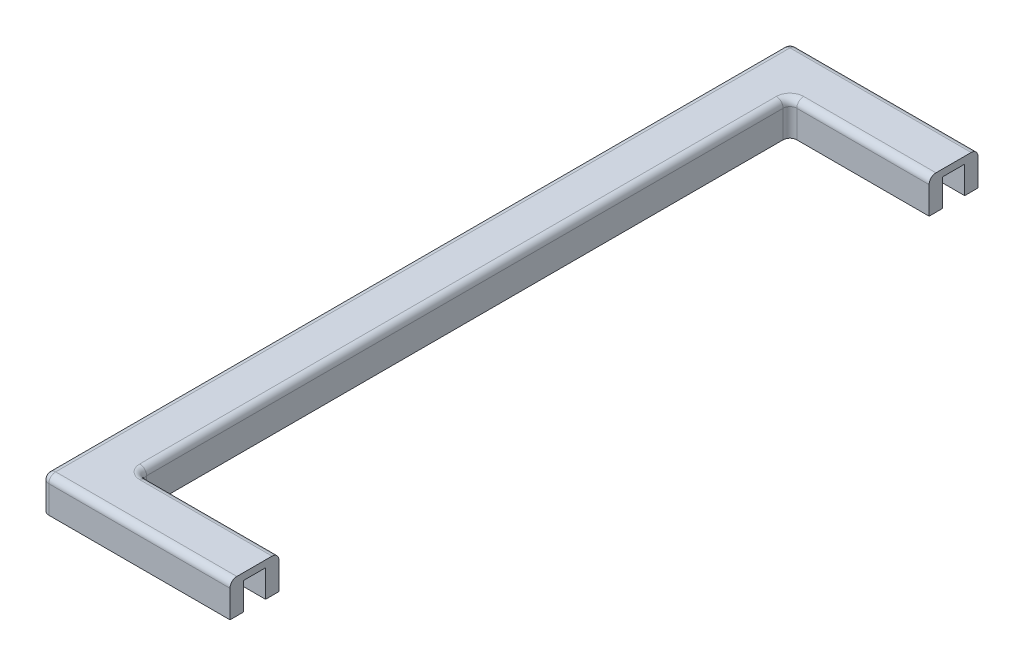
ISO-10303-21;
HEADER;
FILE_DESCRIPTION(('STEP AP214'),'2;1');
FILE_NAME('part.step','',(''),(''),'','','');
FILE_SCHEMA(('AUTOMOTIVE_DESIGN { 1 0 10303 214 1 1 1 1 }'));
ENDSEC;
DATA;
#1=APPLICATION_CONTEXT('core data for automotive mechanical design processes');
#2=APPLICATION_PROTOCOL_DEFINITION('international standard','automotive_design',2000,#1);
#3=PRODUCT_CONTEXT('',#1,'mechanical');
#4=PRODUCT('Part','Part','',(#3));
#5=PRODUCT_RELATED_PRODUCT_CATEGORY('part','',(#4));
#6=PRODUCT_DEFINITION_FORMATION('','',#4);
#7=PRODUCT_DEFINITION_CONTEXT('part definition',#1,'design');
#8=PRODUCT_DEFINITION('design','',#6,#7);
#9=PRODUCT_DEFINITION_SHAPE('','',#8);
#10=(LENGTH_UNIT() NAMED_UNIT(*) SI_UNIT(.MILLI.,.METRE.));
#11=(NAMED_UNIT(*) PLANE_ANGLE_UNIT() SI_UNIT($,.RADIAN.));
#12=(NAMED_UNIT(*) SI_UNIT($,.STERADIAN.) SOLID_ANGLE_UNIT());
#13=UNCERTAINTY_MEASURE_WITH_UNIT(LENGTH_MEASURE(1.E-05),#10,'distance_accuracy_value','');
#14=(GEOMETRIC_REPRESENTATION_CONTEXT(3) GLOBAL_UNCERTAINTY_ASSIGNED_CONTEXT((#13)) GLOBAL_UNIT_ASSIGNED_CONTEXT((#10,
#11,#12)) REPRESENTATION_CONTEXT('',''));
#15=CARTESIAN_POINT('',(0.,0.,0.));
#16=DIRECTION('',(0.,0.,1.));
#17=DIRECTION('',(1.,0.,0.));
#18=AXIS2_PLACEMENT_3D('',#15,#16,#17);
#19=CARTESIAN_POINT('',(0.,8.,0.));
#20=DIRECTION('',(0.,-1.,0.));
#21=DIRECTION('',(0.,0.,-1.));
#22=AXIS2_PLACEMENT_3D('',#19,#20,#21);
#23=PLANE('',#22);
#24=DIRECTION('',(0.,0.,-1.));
#25=VECTOR('',#24,1.);
#26=CARTESIAN_POINT('',(-79.075,8.,0.));
#27=LINE('',#26,#25);
#28=CARTESIAN_POINT('',(-79.075,8.,105.5));
#29=VERTEX_POINT('',#28);
#30=CARTESIAN_POINT('',(-79.075,8.,99.));
#31=VERTEX_POINT('',#30);
#32=EDGE_CURVE('E369',#29,#31,#27,.T.);
#33=ORIENTED_EDGE('',*,*,#32,.F.);
#34=DIRECTION('',(1.,0.,0.));
#35=VECTOR('',#34,1.);
#36=CARTESIAN_POINT('',(0.,8.,105.5));
#37=LINE('',#36,#35);
#38=CARTESIAN_POINT('',(-130.175,8.,105.5));
#39=VERTEX_POINT('',#38);
#40=EDGE_CURVE('E407',#39,#29,#37,.T.);
#41=ORIENTED_EDGE('',*,*,#40,.F.);
#42=DIRECTION('',(0.,0.,-1.));
#43=VECTOR('',#42,1.);
#44=CARTESIAN_POINT('',(-130.175,8.,0.));
#45=LINE('',#44,#43);
#46=CARTESIAN_POINT('',(-130.175,8.,-105.5));
#47=VERTEX_POINT('',#46);
#48=EDGE_CURVE('E410',#39,#47,#45,.T.);
#49=ORIENTED_EDGE('',*,*,#48,.T.);
#50=DIRECTION('',(1.,0.,0.));
#51=VECTOR('',#50,1.);
#52=CARTESIAN_POINT('',(0.,8.,-105.5));
#53=LINE('',#52,#51);
#54=CARTESIAN_POINT('',(-79.075,8.,-105.5));
#55=VERTEX_POINT('',#54);
#56=EDGE_CURVE('E414',#47,#55,#53,.T.);
#57=ORIENTED_EDGE('',*,*,#56,.T.);
#58=CARTESIAN_POINT('',(-79.075,8.,-99.));
#59=VERTEX_POINT('',#58);
#60=EDGE_CURVE('E366',#59,#55,#27,.T.);
#61=ORIENTED_EDGE('',*,*,#60,.F.);
#62=DIRECTION('',(1.,0.,0.));
#63=VECTOR('',#62,1.);
#64=CARTESIAN_POINT('',(0.,8.,-99.));
#65=LINE('',#64,#63);
#66=CARTESIAN_POINT('',(-123.675,8.,-99.));
#67=VERTEX_POINT('',#66);
#68=EDGE_CURVE('E379',#67,#59,#65,.T.);
#69=ORIENTED_EDGE('',*,*,#68,.F.);
#70=DIRECTION('',(0.,0.,-1.));
#71=VECTOR('',#70,1.);
#72=CARTESIAN_POINT('',(-123.675,8.,0.));
#73=LINE('',#72,#71);
#74=CARTESIAN_POINT('',(-123.675,8.,99.));
#75=VERTEX_POINT('',#74);
#76=EDGE_CURVE('E383',#75,#67,#73,.T.);
#77=ORIENTED_EDGE('',*,*,#76,.F.);
#78=DIRECTION('',(1.,0.,0.));
#79=VECTOR('',#78,1.);
#80=CARTESIAN_POINT('',(0.,8.,99.));
#81=LINE('',#80,#79);
#82=EDGE_CURVE('E376',#75,#31,#81,.T.);
#83=ORIENTED_EDGE('',*,*,#82,.T.);
#84=EDGE_LOOP('',(#33,#41,#49,#57,#61,#69,#77,#83));
#85=FACE_BOUND('',#84,.T.);
#86=ADVANCED_FACE('F65',(#85),#23,.T.);
#87=CARTESIAN_POINT('',(0.,8.,109.4));
#88=DIRECTION('',(0.,0.,-1.));
#89=DIRECTION('',(-1.,0.,0.));
#90=AXIS2_PLACEMENT_3D('',#87,#88,#89);
#91=PLANE('',#90);
#92=DIRECTION('',(1.,0.,0.));
#93=VECTOR('',#92,1.);
#94=CARTESIAN_POINT('',(0.,0.,109.4));
#95=LINE('',#94,#93);
#96=CARTESIAN_POINT('',(-132.075,0.,109.4));
#97=VERTEX_POINT('',#96);
#98=CARTESIAN_POINT('',(-79.075,0.,109.4));
#99=VERTEX_POINT('',#98);
#100=EDGE_CURVE('E425',#97,#99,#95,.T.);
#101=ORIENTED_EDGE('',*,*,#100,.T.);
#102=DIRECTION('',(0.,1.,0.));
#103=VECTOR('',#102,1.);
#104=CARTESIAN_POINT('',(-79.075,8.,109.4));
#105=LINE('',#104,#103);
#106=CARTESIAN_POINT('',(-79.075,8.,109.4));
#107=VERTEX_POINT('',#106);
#108=EDGE_CURVE('E237',#99,#107,#105,.T.);
#109=ORIENTED_EDGE('',*,*,#108,.T.);
#110=DIRECTION('',(1.,0.,0.));
#111=VECTOR('',#110,1.);
#112=CARTESIAN_POINT('',(0.,8.,109.4));
#113=LINE('',#112,#111);
#114=CARTESIAN_POINT('',(-132.075,8.,109.4));
#115=VERTEX_POINT('',#114);
#116=EDGE_CURVE('E273',#107,#115,#113,.F.);
#117=ORIENTED_EDGE('',*,*,#116,.T.);
#118=DIRECTION('',(0.,-1.,0.));
#119=VECTOR('',#118,1.);
#120=CARTESIAN_POINT('',(-132.075,0.,109.4));
#121=LINE('',#120,#119);
#122=EDGE_CURVE('E275',#115,#97,#121,.T.);
#123=ORIENTED_EDGE('',*,*,#122,.T.);
#124=EDGE_LOOP('',(#101,#109,#117,#123));
#125=FACE_BOUND('',#124,.T.);
#126=ADVANCED_FACE('F488',(#125),#91,.F.);
#127=CARTESIAN_POINT('',(0.,8.,-109.4));
#128=DIRECTION('',(0.,0.,-1.));
#129=DIRECTION('',(-1.,0.,0.));
#130=AXIS2_PLACEMENT_3D('',#127,#128,#129);
#131=PLANE('',#130);
#132=DIRECTION('',(0.,1.,0.));
#133=VECTOR('',#132,1.);
#134=CARTESIAN_POINT('',(-79.075,8.,-109.4));
#135=LINE('',#134,#133);
#136=CARTESIAN_POINT('',(-79.075,0.,-109.4));
#137=VERTEX_POINT('',#136);
#138=CARTESIAN_POINT('',(-79.075,8.,-109.4));
#139=VERTEX_POINT('',#138);
#140=EDGE_CURVE('E232',#137,#139,#135,.T.);
#141=ORIENTED_EDGE('',*,*,#140,.F.);
#142=DIRECTION('',(1.,0.,0.));
#143=VECTOR('',#142,1.);
#144=CARTESIAN_POINT('',(0.,0.,-109.4));
#145=LINE('',#144,#143);
#146=CARTESIAN_POINT('',(-132.075,0.,-109.4));
#147=VERTEX_POINT('',#146);
#148=EDGE_CURVE('E428',#147,#137,#145,.T.);
#149=ORIENTED_EDGE('',*,*,#148,.F.);
#150=DIRECTION('',(0.,-1.,0.));
#151=VECTOR('',#150,1.);
#152=CARTESIAN_POINT('',(-132.075,8.,-109.4));
#153=LINE('',#152,#151);
#154=CARTESIAN_POINT('',(-132.075,8.,-109.4));
#155=VERTEX_POINT('',#154);
#156=EDGE_CURVE('E294',#147,#155,#153,.F.);
#157=ORIENTED_EDGE('',*,*,#156,.T.);
#158=DIRECTION('',(-1.,0.,0.));
#159=VECTOR('',#158,1.);
#160=CARTESIAN_POINT('',(134.075,8.,-109.4));
#161=LINE('',#160,#159);
#162=EDGE_CURVE('E292',#155,#139,#161,.F.);
#163=ORIENTED_EDGE('',*,*,#162,.T.);
#164=EDGE_LOOP('',(#141,#149,#157,#163));
#165=FACE_BOUND('',#164,.T.);
#166=ADVANCED_FACE('F513',(#165),#131,.T.);
#167=CARTESIAN_POINT('',(0.,8.,105.5));
#168=DIRECTION('',(0.,0.,-1.));
#169=DIRECTION('',(-1.,0.,0.));
#170=AXIS2_PLACEMENT_3D('',#167,#168,#169);
#171=PLANE('',#170);
#172=DIRECTION('',(0.,1.,0.));
#173=VECTOR('',#172,1.);
#174=CARTESIAN_POINT('',(-79.075,8.,105.5));
#175=LINE('',#174,#173);
#176=CARTESIAN_POINT('',(-79.075,0.,105.5));
#177=VERTEX_POINT('',#176);
#178=EDGE_CURVE('E331',#177,#29,#175,.T.);
#179=ORIENTED_EDGE('',*,*,#178,.F.);
#180=DIRECTION('',(1.,0.,0.));
#181=VECTOR('',#180,1.);
#182=CARTESIAN_POINT('',(0.,0.,105.5));
#183=LINE('',#182,#181);
#184=CARTESIAN_POINT('',(-130.175,0.,105.5));
#185=VERTEX_POINT('',#184);
#186=EDGE_CURVE('E406',#185,#177,#183,.T.);
#187=ORIENTED_EDGE('',*,*,#186,.F.);
#188=DIRECTION('',(0.,-1.,0.));
#189=VECTOR('',#188,1.);
#190=CARTESIAN_POINT('',(-130.175,8.,105.5));
#191=LINE('',#190,#189);
#192=EDGE_CURVE('E258',#39,#185,#191,.T.);
#193=ORIENTED_EDGE('',*,*,#192,.F.);
#194=ORIENTED_EDGE('',*,*,#40,.T.);
#195=EDGE_LOOP('',(#179,#187,#193,#194));
#196=FACE_BOUND('',#195,.T.);
#197=ADVANCED_FACE('F447',(#196),#171,.T.);
#198=CARTESIAN_POINT('',(-130.175,8.,0.));
#199=DIRECTION('',(-1.,0.,0.));
#200=DIRECTION('',(0.,0.,1.));
#201=AXIS2_PLACEMENT_3D('',#198,#199,#200);
#202=PLANE('',#201);
#203=DIRECTION('',(0.,0.,-1.));
#204=VECTOR('',#203,1.);
#205=CARTESIAN_POINT('',(-130.175,0.,0.));
#206=LINE('',#205,#204);
#207=CARTESIAN_POINT('',(-130.175,0.,-105.5));
#208=VERTEX_POINT('',#207);
#209=EDGE_CURVE('E420',#185,#208,#206,.T.);
#210=ORIENTED_EDGE('',*,*,#209,.T.);
#211=DIRECTION('',(0.,-1.,0.));
#212=VECTOR('',#211,1.);
#213=CARTESIAN_POINT('',(-130.175,8.,-105.5));
#214=LINE('',#213,#212);
#215=EDGE_CURVE('E417',#47,#208,#214,.T.);
#216=ORIENTED_EDGE('',*,*,#215,.F.);
#217=ORIENTED_EDGE('',*,*,#48,.F.);
#218=ORIENTED_EDGE('',*,*,#192,.T.);
#219=EDGE_LOOP('',(#210,#216,#217,#218));
#220=FACE_BOUND('',#219,.T.);
#221=ADVANCED_FACE('F437',(#220),#202,.F.);
#222=CARTESIAN_POINT('',(0.,8.,-105.5));
#223=DIRECTION('',(0.,0.,-1.));
#224=DIRECTION('',(-1.,0.,0.));
#225=AXIS2_PLACEMENT_3D('',#222,#223,#224);
#226=PLANE('',#225);
#227=DIRECTION('',(1.,0.,0.));
#228=VECTOR('',#227,1.);
#229=CARTESIAN_POINT('',(0.,0.,-105.5));
#230=LINE('',#229,#228);
#231=CARTESIAN_POINT('',(-79.075,0.,-105.5));
#232=VERTEX_POINT('',#231);
#233=EDGE_CURVE('E422',#208,#232,#230,.T.);
#234=ORIENTED_EDGE('',*,*,#233,.T.);
#235=DIRECTION('',(0.,1.,0.));
#236=VECTOR('',#235,1.);
#237=CARTESIAN_POINT('',(-79.075,8.,-105.5));
#238=LINE('',#237,#236);
#239=EDGE_CURVE('E368',#232,#55,#238,.T.);
#240=ORIENTED_EDGE('',*,*,#239,.T.);
#241=ORIENTED_EDGE('',*,*,#56,.F.);
#242=ORIENTED_EDGE('',*,*,#215,.T.);
#243=EDGE_LOOP('',(#234,#240,#241,#242));
#244=FACE_BOUND('',#243,.T.);
#245=ADVANCED_FACE('F522',(#244),#226,.F.);
#246=CARTESIAN_POINT('',(-134.075,8.,0.));
#247=DIRECTION('',(-1.,0.,0.));
#248=DIRECTION('',(0.,0.,1.));
#249=AXIS2_PLACEMENT_3D('',#246,#247,#248);
#250=PLANE('',#249);
#251=DIRECTION('',(0.,0.,1.));
#252=VECTOR('',#251,1.);
#253=CARTESIAN_POINT('',(-134.075,8.,-109.4));
#254=LINE('',#253,#252);
#255=CARTESIAN_POINT('',(-134.075,8.,107.4));
#256=VERTEX_POINT('',#255);
#257=CARTESIAN_POINT('',(-134.075,8.,-107.4));
#258=VERTEX_POINT('',#257);
#259=EDGE_CURVE('E298',#256,#258,#254,.F.);
#260=ORIENTED_EDGE('',*,*,#259,.T.);
#261=DIRECTION('',(0.,-1.,0.));
#262=VECTOR('',#261,1.);
#263=CARTESIAN_POINT('',(-134.075,8.,-107.4));
#264=LINE('',#263,#262);
#265=CARTESIAN_POINT('',(-134.075,0.,-107.4));
#266=VERTEX_POINT('',#265);
#267=EDGE_CURVE('E300',#258,#266,#264,.T.);
#268=ORIENTED_EDGE('',*,*,#267,.T.);
#269=DIRECTION('',(0.,0.,-1.));
#270=VECTOR('',#269,1.);
#271=CARTESIAN_POINT('',(-134.075,0.,0.));
#272=LINE('',#271,#270);
#273=CARTESIAN_POINT('',(-134.075,0.,107.4));
#274=VERTEX_POINT('',#273);
#275=EDGE_CURVE('E411',#274,#266,#272,.T.);
#276=ORIENTED_EDGE('',*,*,#275,.F.);
#277=DIRECTION('',(0.,-1.,0.));
#278=VECTOR('',#277,1.);
#279=CARTESIAN_POINT('',(-134.075,10.,107.4));
#280=LINE('',#279,#278);
#281=EDGE_CURVE('E296',#274,#256,#280,.F.);
#282=ORIENTED_EDGE('',*,*,#281,.T.);
#283=EDGE_LOOP('',(#260,#268,#276,#282));
#284=FACE_BOUND('',#283,.T.);
#285=ADVANCED_FACE('F492',(#284),#250,.T.);
#286=CARTESIAN_POINT('',(0.,0.,0.));
#287=DIRECTION('',(0.,1.,0.));
#288=DIRECTION('',(0.,0.,1.));
#289=AXIS2_PLACEMENT_3D('',#286,#287,#288);
#290=PLANE('',#289);
#291=ORIENTED_EDGE('',*,*,#148,.T.);
#292=DIRECTION('',(0.,0.,1.));
#293=VECTOR('',#292,1.);
#294=CARTESIAN_POINT('',(-79.075,0.,150.));
#295=LINE('',#294,#293);
#296=EDGE_CURVE('E357',#137,#232,#295,.T.);
#297=ORIENTED_EDGE('',*,*,#296,.T.);
#298=ORIENTED_EDGE('',*,*,#233,.F.);
#299=ORIENTED_EDGE('',*,*,#209,.F.);
#300=ORIENTED_EDGE('',*,*,#186,.T.);
#301=EDGE_CURVE('E247',#177,#99,#295,.T.);
#302=ORIENTED_EDGE('',*,*,#301,.T.);
#303=ORIENTED_EDGE('',*,*,#100,.F.);
#304=CARTESIAN_POINT('',(-132.075,0.,107.4));
#305=DIRECTION('',(0.,1.,0.));
#306=DIRECTION('',(0.,0.,1.));
#307=AXIS2_PLACEMENT_3D('',#304,#305,#306);
#308=CIRCLE('',#307,2.);
#309=EDGE_CURVE('E302',#97,#274,#308,.F.);
#310=ORIENTED_EDGE('',*,*,#309,.T.);
#311=ORIENTED_EDGE('',*,*,#275,.T.);
#312=CARTESIAN_POINT('',(-132.075,0.,-107.4));
#313=DIRECTION('',(0.,1.,0.));
#314=DIRECTION('',(0.,0.,1.));
#315=AXIS2_PLACEMENT_3D('',#312,#313,#314);
#316=CIRCLE('',#315,2.);
#317=EDGE_CURVE('E304',#266,#147,#316,.F.);
#318=ORIENTED_EDGE('',*,*,#317,.T.);
#319=EDGE_LOOP('',(#291,#297,#298,#299,#300,#302,#303,#310,#311,#318));
#320=FACE_BOUND('',#319,.T.);
#321=ADVANCED_FACE('F443',(#320),#290,.F.);
#322=CARTESIAN_POINT('',(0.,10.,0.));
#323=DIRECTION('',(0.,-1.,0.));
#324=DIRECTION('',(0.,0.,-1.));
#325=AXIS2_PLACEMENT_3D('',#322,#323,#324);
#326=PLANE('',#325);
#327=DIRECTION('',(1.,0.,0.));
#328=VECTOR('',#327,1.);
#329=CARTESIAN_POINT('',(0.,10.,107.4));
#330=LINE('',#329,#328);
#331=CARTESIAN_POINT('',(-132.075,10.,107.4));
#332=VERTEX_POINT('',#331);
#333=CARTESIAN_POINT('',(-79.075,10.,107.4));
#334=VERTEX_POINT('',#333);
#335=EDGE_CURVE('E254',#332,#334,#330,.T.);
#336=ORIENTED_EDGE('',*,*,#335,.T.);
#337=DIRECTION('',(0.,0.,1.));
#338=VECTOR('',#337,1.);
#339=CARTESIAN_POINT('',(-79.075,10.,150.));
#340=LINE('',#339,#338);
#341=CARTESIAN_POINT('',(-79.075,10.,97.1));
#342=VERTEX_POINT('',#341);
#343=EDGE_CURVE('E248',#342,#334,#340,.T.);
#344=ORIENTED_EDGE('',*,*,#343,.F.);
#345=DIRECTION('',(1.,0.,0.));
#346=VECTOR('',#345,1.);
#347=CARTESIAN_POINT('',(-119.775,10.,97.1));
#348=LINE('',#347,#346);
#349=CARTESIAN_POINT('',(-117.775,10.,97.1));
#350=VERTEX_POINT('',#349);
#351=EDGE_CURVE('E271',#342,#350,#348,.F.);
#352=ORIENTED_EDGE('',*,*,#351,.T.);
#353=CARTESIAN_POINT('',(-117.775,10.,93.1));
#354=DIRECTION('',(0.,-1.,0.));
#355=DIRECTION('',(0.,0.,-1.));
#356=AXIS2_PLACEMENT_3D('',#353,#354,#355);
#357=CIRCLE('',#356,4.);
#358=CARTESIAN_POINT('',(-121.775,10.,93.1));
#359=VERTEX_POINT('',#358);
#360=EDGE_CURVE('E268',#359,#350,#357,.F.);
#361=ORIENTED_EDGE('',*,*,#360,.F.);
#362=DIRECTION('',(0.,0.,1.));
#363=VECTOR('',#362,1.);
#364=CARTESIAN_POINT('',(-121.775,10.,-95.1));
#365=LINE('',#364,#363);
#366=CARTESIAN_POINT('',(-121.775,10.,-93.1));
#367=VERTEX_POINT('',#366);
#368=EDGE_CURVE('E266',#359,#367,#365,.F.);
#369=ORIENTED_EDGE('',*,*,#368,.T.);
#370=CARTESIAN_POINT('',(-117.775,10.,-93.1));
#371=DIRECTION('',(0.,-1.,0.));
#372=DIRECTION('',(0.,0.,-1.));
#373=AXIS2_PLACEMENT_3D('',#370,#371,#372);
#374=CIRCLE('',#373,4.);
#375=CARTESIAN_POINT('',(-117.775,10.,-97.1));
#376=VERTEX_POINT('',#375);
#377=EDGE_CURVE('E263',#376,#367,#374,.F.);
#378=ORIENTED_EDGE('',*,*,#377,.F.);
#379=DIRECTION('',(-1.,0.,0.));
#380=VECTOR('',#379,1.);
#381=CARTESIAN_POINT('',(119.775,10.,-97.1));
#382=LINE('',#381,#380);
#383=CARTESIAN_POINT('',(-79.075,10.,-97.1));
#384=VERTEX_POINT('',#383);
#385=EDGE_CURVE('E246',#376,#384,#382,.F.);
#386=ORIENTED_EDGE('',*,*,#385,.T.);
#387=CARTESIAN_POINT('',(-79.075,10.,-107.4));
#388=VERTEX_POINT('',#387);
#389=EDGE_CURVE('E80',#388,#384,#340,.T.);
#390=ORIENTED_EDGE('',*,*,#389,.F.);
#391=DIRECTION('',(-1.,0.,0.));
#392=VECTOR('',#391,1.);
#393=CARTESIAN_POINT('',(-134.075,10.,-107.4));
#394=LINE('',#393,#392);
#395=CARTESIAN_POINT('',(-132.075,10.,-107.4));
#396=VERTEX_POINT('',#395);
#397=EDGE_CURVE('E243',#388,#396,#394,.T.);
#398=ORIENTED_EDGE('',*,*,#397,.T.);
#399=DIRECTION('',(0.,0.,1.));
#400=VECTOR('',#399,1.);
#401=CARTESIAN_POINT('',(-132.075,10.,109.4));
#402=LINE('',#401,#400);
#403=EDGE_CURVE('E255',#396,#332,#402,.T.);
#404=ORIENTED_EDGE('',*,*,#403,.T.);
#405=EDGE_LOOP('',(#336,#344,#352,#361,#369,#378,#386,#390,#398,#404));
#406=FACE_BOUND('',#405,.T.);
#407=ADVANCED_FACE('F242',(#406),#326,.F.);
#408=CARTESIAN_POINT('',(-119.775,10.,-95.1));
#409=DIRECTION('',(1.,0.,0.));
#410=DIRECTION('',(0.,0.,-1.));
#411=AXIS2_PLACEMENT_3D('',#408,#409,#410);
#412=PLANE('',#411);
#413=DIRECTION('',(0.,0.,1.));
#414=VECTOR('',#413,1.);
#415=CARTESIAN_POINT('',(-119.775,8.,95.1));
#416=LINE('',#415,#414);
#417=CARTESIAN_POINT('',(-119.775,8.,-93.1));
#418=VERTEX_POINT('',#417);
#419=CARTESIAN_POINT('',(-119.775,8.,93.1));
#420=VERTEX_POINT('',#419);
#421=EDGE_CURVE('E284',#418,#420,#416,.T.);
#422=ORIENTED_EDGE('',*,*,#421,.T.);
#423=DIRECTION('',(0.,-1.,0.));
#424=VECTOR('',#423,1.);
#425=CARTESIAN_POINT('',(-119.775,0.,93.1));
#426=LINE('',#425,#424);
#427=CARTESIAN_POINT('',(-119.775,0.,93.1));
#428=VERTEX_POINT('',#427);
#429=EDGE_CURVE('E286',#420,#428,#426,.T.);
#430=ORIENTED_EDGE('',*,*,#429,.T.);
#431=DIRECTION('',(0.,0.,-1.));
#432=VECTOR('',#431,1.);
#433=CARTESIAN_POINT('',(-119.775,0.,0.));
#434=LINE('',#433,#432);
#435=CARTESIAN_POINT('',(-119.775,0.,-93.1));
#436=VERTEX_POINT('',#435);
#437=EDGE_CURVE('E389',#428,#436,#434,.T.);
#438=ORIENTED_EDGE('',*,*,#437,.T.);
#439=DIRECTION('',(0.,-1.,0.));
#440=VECTOR('',#439,1.);
#441=CARTESIAN_POINT('',(-119.775,10.,-93.1));
#442=LINE('',#441,#440);
#443=EDGE_CURVE('E282',#436,#418,#442,.F.);
#444=ORIENTED_EDGE('',*,*,#443,.T.);
#445=EDGE_LOOP('',(#422,#430,#438,#444));
#446=FACE_BOUND('',#445,.T.);
#447=ADVANCED_FACE('F714',(#446),#412,.T.);
#448=CARTESIAN_POINT('',(-119.775,10.,95.1));
#449=DIRECTION('',(0.,0.,-1.));
#450=DIRECTION('',(-1.,0.,0.));
#451=AXIS2_PLACEMENT_3D('',#448,#449,#450);
#452=PLANE('',#451);
#453=DIRECTION('',(0.,1.,0.));
#454=VECTOR('',#453,1.);
#455=CARTESIAN_POINT('',(-79.075,10.,95.1));
#456=LINE('',#455,#454);
#457=CARTESIAN_POINT('',(-79.075,0.,95.1));
#458=VERTEX_POINT('',#457);
#459=CARTESIAN_POINT('',(-79.075,8.,95.1));
#460=VERTEX_POINT('',#459);
#461=EDGE_CURVE('E87',#458,#460,#456,.T.);
#462=ORIENTED_EDGE('',*,*,#461,.F.);
#463=DIRECTION('',(1.,0.,0.));
#464=VECTOR('',#463,1.);
#465=CARTESIAN_POINT('',(0.,0.,95.1));
#466=LINE('',#465,#464);
#467=CARTESIAN_POINT('',(-117.775,0.,95.1));
#468=VERTEX_POINT('',#467);
#469=EDGE_CURVE('E326',#468,#458,#466,.T.);
#470=ORIENTED_EDGE('',*,*,#469,.F.);
#471=DIRECTION('',(0.,-1.,0.));
#472=VECTOR('',#471,1.);
#473=CARTESIAN_POINT('',(-117.775,10.,95.1));
#474=LINE('',#473,#472);
#475=CARTESIAN_POINT('',(-117.775,8.,95.1));
#476=VERTEX_POINT('',#475);
#477=EDGE_CURVE('E280',#468,#476,#474,.F.);
#478=ORIENTED_EDGE('',*,*,#477,.T.);
#479=DIRECTION('',(1.,0.,0.));
#480=VECTOR('',#479,1.);
#481=CARTESIAN_POINT('',(119.775,8.,95.1));
#482=LINE('',#481,#480);
#483=EDGE_CURVE('E277',#476,#460,#482,.T.);
#484=ORIENTED_EDGE('',*,*,#483,.T.);
#485=EDGE_LOOP('',(#462,#470,#478,#484));
#486=FACE_BOUND('',#485,.T.);
#487=ADVANCED_FACE('F699',(#486),#452,.T.);
#488=CARTESIAN_POINT('',(-119.775,10.,-95.1));
#489=DIRECTION('',(0.,0.,1.));
#490=DIRECTION('',(1.,0.,0.));
#491=AXIS2_PLACEMENT_3D('',#488,#489,#490);
#492=PLANE('',#491);
#493=DIRECTION('',(0.,-1.,0.));
#494=VECTOR('',#493,1.);
#495=CARTESIAN_POINT('',(-79.075,10.,-95.1));
#496=LINE('',#495,#494);
#497=CARTESIAN_POINT('',(-79.075,8.,-95.1));
#498=VERTEX_POINT('',#497);
#499=CARTESIAN_POINT('',(-79.075,0.,-95.1));
#500=VERTEX_POINT('',#499);
#501=EDGE_CURVE('E353',#498,#500,#496,.T.);
#502=ORIENTED_EDGE('',*,*,#501,.F.);
#503=DIRECTION('',(-1.,0.,0.));
#504=VECTOR('',#503,1.);
#505=CARTESIAN_POINT('',(-119.775,8.,-95.1));
#506=LINE('',#505,#504);
#507=CARTESIAN_POINT('',(-117.775,8.,-95.1));
#508=VERTEX_POINT('',#507);
#509=EDGE_CURVE('E288',#498,#508,#506,.T.);
#510=ORIENTED_EDGE('',*,*,#509,.T.);
#511=DIRECTION('',(0.,-1.,0.));
#512=VECTOR('',#511,1.);
#513=CARTESIAN_POINT('',(-117.775,0.,-95.1));
#514=LINE('',#513,#512);
#515=CARTESIAN_POINT('',(-117.775,0.,-95.1));
#516=VERTEX_POINT('',#515);
#517=EDGE_CURVE('E290',#508,#516,#514,.T.);
#518=ORIENTED_EDGE('',*,*,#517,.T.);
#519=DIRECTION('',(1.,0.,0.));
#520=VECTOR('',#519,1.);
#521=CARTESIAN_POINT('',(0.,0.,-95.1));
#522=LINE('',#521,#520);
#523=EDGE_CURVE('E392',#516,#500,#522,.T.);
#524=ORIENTED_EDGE('',*,*,#523,.T.);
#525=EDGE_LOOP('',(#502,#510,#518,#524));
#526=FACE_BOUND('',#525,.T.);
#527=ADVANCED_FACE('F692',(#526),#492,.T.);
#528=CARTESIAN_POINT('',(0.,8.,99.));
#529=DIRECTION('',(0.,0.,-1.));
#530=DIRECTION('',(-1.,0.,0.));
#531=AXIS2_PLACEMENT_3D('',#528,#529,#530);
#532=PLANE('',#531);
#533=DIRECTION('',(1.,0.,0.));
#534=VECTOR('',#533,1.);
#535=CARTESIAN_POINT('',(0.,0.,99.));
#536=LINE('',#535,#534);
#537=CARTESIAN_POINT('',(-123.675,0.,99.));
#538=VERTEX_POINT('',#537);
#539=CARTESIAN_POINT('',(-79.075,0.,99.));
#540=VERTEX_POINT('',#539);
#541=EDGE_CURVE('E395',#538,#540,#536,.T.);
#542=ORIENTED_EDGE('',*,*,#541,.T.);
#543=DIRECTION('',(0.,1.,0.));
#544=VECTOR('',#543,1.);
#545=CARTESIAN_POINT('',(-79.075,8.,99.));
#546=LINE('',#545,#544);
#547=EDGE_CURVE('E372',#540,#31,#546,.T.);
#548=ORIENTED_EDGE('',*,*,#547,.T.);
#549=ORIENTED_EDGE('',*,*,#82,.F.);
#550=DIRECTION('',(0.,-1.,0.));
#551=VECTOR('',#550,1.);
#552=CARTESIAN_POINT('',(-123.675,8.,99.));
#553=LINE('',#552,#551);
#554=EDGE_CURVE('E386',#75,#538,#553,.T.);
#555=ORIENTED_EDGE('',*,*,#554,.T.);
#556=EDGE_LOOP('',(#542,#548,#549,#555));
#557=FACE_BOUND('',#556,.T.);
#558=ADVANCED_FACE('F454',(#557),#532,.F.);
#559=CARTESIAN_POINT('',(0.,8.,-99.));
#560=DIRECTION('',(0.,0.,-1.));
#561=DIRECTION('',(-1.,0.,0.));
#562=AXIS2_PLACEMENT_3D('',#559,#560,#561);
#563=PLANE('',#562);
#564=DIRECTION('',(0.,1.,0.));
#565=VECTOR('',#564,1.);
#566=CARTESIAN_POINT('',(-79.075,8.,-99.));
#567=LINE('',#566,#565);
#568=CARTESIAN_POINT('',(-79.075,0.,-99.));
#569=VERTEX_POINT('',#568);
#570=EDGE_CURVE('E364',#569,#59,#567,.T.);
#571=ORIENTED_EDGE('',*,*,#570,.F.);
#572=DIRECTION('',(1.,0.,0.));
#573=VECTOR('',#572,1.);
#574=CARTESIAN_POINT('',(0.,0.,-99.));
#575=LINE('',#574,#573);
#576=CARTESIAN_POINT('',(-123.675,0.,-99.));
#577=VERTEX_POINT('',#576);
#578=EDGE_CURVE('E398',#577,#569,#575,.T.);
#579=ORIENTED_EDGE('',*,*,#578,.F.);
#580=DIRECTION('',(0.,-1.,0.));
#581=VECTOR('',#580,1.);
#582=CARTESIAN_POINT('',(-123.675,8.,-99.));
#583=LINE('',#582,#581);
#584=EDGE_CURVE('E404',#67,#577,#583,.T.);
#585=ORIENTED_EDGE('',*,*,#584,.F.);
#586=ORIENTED_EDGE('',*,*,#68,.T.);
#587=EDGE_LOOP('',(#571,#579,#585,#586));
#588=FACE_BOUND('',#587,.T.);
#589=ADVANCED_FACE('F793',(#588),#563,.T.);
#590=CARTESIAN_POINT('',(-123.675,8.,0.));
#591=DIRECTION('',(-1.,0.,0.));
#592=DIRECTION('',(0.,0.,1.));
#593=AXIS2_PLACEMENT_3D('',#590,#591,#592);
#594=PLANE('',#593);
#595=DIRECTION('',(0.,0.,-1.));
#596=VECTOR('',#595,1.);
#597=CARTESIAN_POINT('',(-123.675,0.,0.));
#598=LINE('',#597,#596);
#599=EDGE_CURVE('E380',#538,#577,#598,.T.);
#600=ORIENTED_EDGE('',*,*,#599,.F.);
#601=ORIENTED_EDGE('',*,*,#554,.F.);
#602=ORIENTED_EDGE('',*,*,#76,.T.);
#603=ORIENTED_EDGE('',*,*,#584,.T.);
#604=EDGE_LOOP('',(#600,#601,#602,#603));
#605=FACE_BOUND('',#604,.T.);
#606=ADVANCED_FACE('F783',(#605),#594,.T.);
#607=CARTESIAN_POINT('',(0.,0.,0.));
#608=DIRECTION('',(0.,1.,0.));
#609=DIRECTION('',(0.,0.,1.));
#610=AXIS2_PLACEMENT_3D('',#607,#608,#609);
#611=PLANE('',#610);
#612=ORIENTED_EDGE('',*,*,#578,.T.);
#613=EDGE_CURVE('E462',#569,#500,#295,.T.);
#614=ORIENTED_EDGE('',*,*,#613,.T.);
#615=ORIENTED_EDGE('',*,*,#523,.F.);
#616=CARTESIAN_POINT('',(-117.775,0.,-93.1));
#617=DIRECTION('',(0.,1.,0.));
#618=DIRECTION('',(0.,0.,1.));
#619=AXIS2_PLACEMENT_3D('',#616,#617,#618);
#620=CIRCLE('',#619,2.);
#621=EDGE_CURVE('E73',#516,#436,#620,.T.);
#622=ORIENTED_EDGE('',*,*,#621,.T.);
#623=ORIENTED_EDGE('',*,*,#437,.F.);
#624=CARTESIAN_POINT('',(-117.775,0.,93.1));
#625=DIRECTION('',(0.,1.,0.));
#626=DIRECTION('',(0.,0.,1.));
#627=AXIS2_PLACEMENT_3D('',#624,#625,#626);
#628=CIRCLE('',#627,2.);
#629=EDGE_CURVE('E306',#428,#468,#628,.T.);
#630=ORIENTED_EDGE('',*,*,#629,.T.);
#631=ORIENTED_EDGE('',*,*,#469,.T.);
#632=EDGE_CURVE('E457',#458,#540,#295,.T.);
#633=ORIENTED_EDGE('',*,*,#632,.T.);
#634=ORIENTED_EDGE('',*,*,#541,.F.);
#635=ORIENTED_EDGE('',*,*,#599,.T.);
#636=EDGE_LOOP('',(#612,#614,#615,#622,#623,#630,#631,#633,#634,#635));
#637=FACE_BOUND('',#636,.T.);
#638=ADVANCED_FACE('F459',(#637),#611,.F.);
#639=CARTESIAN_POINT('',(-132.075,8.,-107.4));
#640=DIRECTION('',(0.,-1.,0.));
#641=DIRECTION('',(0.,0.,-1.));
#642=AXIS2_PLACEMENT_3D('',#639,#640,#641);
#643=CYLINDRICAL_SURFACE('',#642,2.);
#644=ORIENTED_EDGE('',*,*,#317,.F.);
#645=ORIENTED_EDGE('',*,*,#267,.F.);
#646=CARTESIAN_POINT('',(-132.075,8.,-107.4));
#647=DIRECTION('',(0.,1.,0.));
#648=DIRECTION('',(0.,0.,1.));
#649=AXIS2_PLACEMENT_3D('',#646,#647,#648);
#650=CIRCLE('',#649,2.);
#651=EDGE_CURVE('E323',#155,#258,#650,.T.);
#652=ORIENTED_EDGE('',*,*,#651,.F.);
#653=ORIENTED_EDGE('',*,*,#156,.F.);
#654=EDGE_LOOP('',(#644,#645,#652,#653));
#655=FACE_BOUND('',#654,.T.);
#656=ADVANCED_FACE('F496',(#655),#643,.T.);
#657=CARTESIAN_POINT('',(0.,8.,-107.4));
#658=DIRECTION('',(1.,0.,0.));
#659=DIRECTION('',(0.,0.,-1.));
#660=AXIS2_PLACEMENT_3D('',#657,#658,#659);
#661=CYLINDRICAL_SURFACE('',#660,2.);
#662=CARTESIAN_POINT('',(-79.075,8.,-107.4));
#663=DIRECTION('',(-1.,0.,0.));
#664=DIRECTION('',(0.,0.,1.));
#665=AXIS2_PLACEMENT_3D('',#662,#663,#664);
#666=CIRCLE('',#665,2.);
#667=EDGE_CURVE('E229',#139,#388,#666,.F.);
#668=ORIENTED_EDGE('',*,*,#667,.F.);
#669=ORIENTED_EDGE('',*,*,#162,.F.);
#670=CARTESIAN_POINT('',(-132.075,8.,-107.4));
#671=DIRECTION('',(-1.,0.,0.));
#672=DIRECTION('',(0.,0.,1.));
#673=AXIS2_PLACEMENT_3D('',#670,#671,#672);
#674=CIRCLE('',#673,2.);
#675=EDGE_CURVE('E252',#396,#155,#674,.T.);
#676=ORIENTED_EDGE('',*,*,#675,.F.);
#677=ORIENTED_EDGE('',*,*,#397,.F.);
#678=EDGE_LOOP('',(#668,#669,#676,#677));
#679=FACE_BOUND('',#678,.T.);
#680=ADVANCED_FACE('F250',(#679),#661,.T.);
#681=CARTESIAN_POINT('',(-132.075,8.,-107.4));
#682=DIRECTION('',(0.,0.,-1.));
#683=DIRECTION('',(-1.,0.,0.));
#684=AXIS2_PLACEMENT_3D('',#681,#682,#683);
#685=SPHERICAL_SURFACE('',#684,2.);
#686=ORIENTED_EDGE('',*,*,#675,.T.);
#687=ORIENTED_EDGE('',*,*,#651,.T.);
#688=CARTESIAN_POINT('',(-132.075,8.,-107.4));
#689=DIRECTION('',(0.,0.,-1.));
#690=DIRECTION('',(-1.,0.,0.));
#691=AXIS2_PLACEMENT_3D('',#688,#689,#690);
#692=CIRCLE('',#691,2.);
#693=EDGE_CURVE('E319',#396,#258,#692,.F.);
#694=ORIENTED_EDGE('',*,*,#693,.F.);
#695=EDGE_LOOP('',(#686,#687,#694));
#696=FACE_BOUND('',#695,.T.);
#697=ADVANCED_FACE('F499',(#696),#685,.T.);
#698=CARTESIAN_POINT('',(-132.075,8.,107.4));
#699=DIRECTION('',(0.,1.,0.));
#700=DIRECTION('',(0.,0.,1.));
#701=AXIS2_PLACEMENT_3D('',#698,#699,#700);
#702=CYLINDRICAL_SURFACE('',#701,2.);
#703=ORIENTED_EDGE('',*,*,#309,.F.);
#704=ORIENTED_EDGE('',*,*,#122,.F.);
#705=CARTESIAN_POINT('',(-132.075,8.,107.4));
#706=DIRECTION('',(0.,1.,0.));
#707=DIRECTION('',(0.,0.,1.));
#708=AXIS2_PLACEMENT_3D('',#705,#706,#707);
#709=CIRCLE('',#708,2.);
#710=EDGE_CURVE('E316',#256,#115,#709,.T.);
#711=ORIENTED_EDGE('',*,*,#710,.F.);
#712=ORIENTED_EDGE('',*,*,#281,.F.);
#713=EDGE_LOOP('',(#703,#704,#711,#712));
#714=FACE_BOUND('',#713,.T.);
#715=ADVANCED_FACE('F485',(#714),#702,.T.);
#716=CARTESIAN_POINT('',(-132.075,8.,0.));
#717=DIRECTION('',(0.,0.,-1.));
#718=DIRECTION('',(-1.,0.,0.));
#719=AXIS2_PLACEMENT_3D('',#716,#717,#718);
#720=CYLINDRICAL_SURFACE('',#719,2.);
#721=ORIENTED_EDGE('',*,*,#693,.T.);
#722=ORIENTED_EDGE('',*,*,#259,.F.);
#723=CARTESIAN_POINT('',(-132.075,8.,107.4));
#724=DIRECTION('',(0.,0.,1.));
#725=DIRECTION('',(1.,0.,0.));
#726=AXIS2_PLACEMENT_3D('',#723,#724,#725);
#727=CIRCLE('',#726,2.);
#728=EDGE_CURVE('E312',#332,#256,#727,.T.);
#729=ORIENTED_EDGE('',*,*,#728,.F.);
#730=ORIENTED_EDGE('',*,*,#403,.F.);
#731=EDGE_LOOP('',(#721,#722,#729,#730));
#732=FACE_BOUND('',#731,.T.);
#733=ADVANCED_FACE('F477',(#732),#720,.T.);
#734=CARTESIAN_POINT('',(-132.075,8.,107.4));
#735=DIRECTION('',(-1.,0.,0.));
#736=DIRECTION('',(0.,0.,1.));
#737=AXIS2_PLACEMENT_3D('',#734,#735,#736);
#738=SPHERICAL_SURFACE('',#737,2.);
#739=ORIENTED_EDGE('',*,*,#728,.T.);
#740=ORIENTED_EDGE('',*,*,#710,.T.);
#741=CARTESIAN_POINT('',(-132.075,8.,107.4));
#742=DIRECTION('',(-1.,0.,0.));
#743=DIRECTION('',(0.,0.,1.));
#744=AXIS2_PLACEMENT_3D('',#741,#742,#743);
#745=CIRCLE('',#744,2.);
#746=EDGE_CURVE('E309',#332,#115,#745,.F.);
#747=ORIENTED_EDGE('',*,*,#746,.F.);
#748=EDGE_LOOP('',(#739,#740,#747));
#749=FACE_BOUND('',#748,.T.);
#750=ADVANCED_FACE('F480',(#749),#738,.T.);
#751=CARTESIAN_POINT('',(0.,8.,107.4));
#752=DIRECTION('',(1.,0.,0.));
#753=DIRECTION('',(0.,0.,-1.));
#754=AXIS2_PLACEMENT_3D('',#751,#752,#753);
#755=CYLINDRICAL_SURFACE('',#754,2.);
#756=CARTESIAN_POINT('',(-79.075,8.,107.4));
#757=DIRECTION('',(-1.,0.,0.));
#758=DIRECTION('',(0.,0.,1.));
#759=AXIS2_PLACEMENT_3D('',#756,#757,#758);
#760=CIRCLE('',#759,2.);
#761=EDGE_CURVE('E355',#334,#107,#760,.F.);
#762=ORIENTED_EDGE('',*,*,#761,.F.);
#763=ORIENTED_EDGE('',*,*,#335,.F.);
#764=ORIENTED_EDGE('',*,*,#746,.T.);
#765=ORIENTED_EDGE('',*,*,#116,.F.);
#766=EDGE_LOOP('',(#762,#763,#764,#765));
#767=FACE_BOUND('',#766,.T.);
#768=ADVANCED_FACE('F471',(#767),#755,.T.);
#769=CARTESIAN_POINT('',(-117.775,10.,-93.1));
#770=DIRECTION('',(0.,1.,0.));
#771=DIRECTION('',(0.,0.,1.));
#772=AXIS2_PLACEMENT_3D('',#769,#770,#771);
#773=CYLINDRICAL_SURFACE('',#772,2.);
#774=ORIENTED_EDGE('',*,*,#621,.F.);
#775=ORIENTED_EDGE('',*,*,#517,.F.);
#776=CARTESIAN_POINT('',(-117.775,8.,-93.1));
#777=DIRECTION('',(0.,-1.,0.));
#778=DIRECTION('',(0.,0.,-1.));
#779=AXIS2_PLACEMENT_3D('',#776,#777,#778);
#780=CIRCLE('',#779,2.);
#781=EDGE_CURVE('E340',#418,#508,#780,.T.);
#782=ORIENTED_EDGE('',*,*,#781,.F.);
#783=ORIENTED_EDGE('',*,*,#443,.F.);
#784=EDGE_LOOP('',(#774,#775,#782,#783));
#785=FACE_BOUND('',#784,.T.);
#786=ADVANCED_FACE('F67',(#785),#773,.F.);
#787=CARTESIAN_POINT('',(-119.775,8.,-97.1));
#788=DIRECTION('',(1.,0.,0.));
#789=DIRECTION('',(0.,0.,-1.));
#790=AXIS2_PLACEMENT_3D('',#787,#788,#789);
#791=CYLINDRICAL_SURFACE('',#790,2.);
#792=CARTESIAN_POINT('',(-79.075,8.,-97.1));
#793=DIRECTION('',(-1.,0.,0.));
#794=DIRECTION('',(0.,0.,1.));
#795=AXIS2_PLACEMENT_3D('',#792,#793,#794);
#796=CIRCLE('',#795,2.);
#797=EDGE_CURVE('E351',#384,#498,#796,.F.);
#798=ORIENTED_EDGE('',*,*,#797,.F.);
#799=ORIENTED_EDGE('',*,*,#385,.F.);
#800=CARTESIAN_POINT('',(-117.775,8.,-97.1));
#801=DIRECTION('',(-1.,0.,0.));
#802=DIRECTION('',(0.,0.,1.));
#803=AXIS2_PLACEMENT_3D('',#800,#801,#802);
#804=CIRCLE('',#803,2.);
#805=EDGE_CURVE('E313',#508,#376,#804,.T.);
#806=ORIENTED_EDGE('',*,*,#805,.F.);
#807=ORIENTED_EDGE('',*,*,#509,.F.);
#808=EDGE_LOOP('',(#798,#799,#806,#807));
#809=FACE_BOUND('',#808,.T.);
#810=ADVANCED_FACE('F350',(#809),#791,.T.);
#811=CARTESIAN_POINT('',(-117.775,8.,-93.1));
#812=DIRECTION('',(0.,-1.,0.));
#813=DIRECTION('',(0.,0.,-1.));
#814=AXIS2_PLACEMENT_3D('',#811,#812,#813);
#815=TOROIDAL_SURFACE('',#814,4.,2.);
#816=ORIENTED_EDGE('',*,*,#805,.T.);
#817=ORIENTED_EDGE('',*,*,#377,.T.);
#818=CARTESIAN_POINT('',(-121.775,8.,-93.1));
#819=DIRECTION('',(0.,0.,-1.));
#820=DIRECTION('',(-1.,0.,0.));
#821=AXIS2_PLACEMENT_3D('',#818,#819,#820);
#822=CIRCLE('',#821,2.);
#823=EDGE_CURVE('E337',#418,#367,#822,.F.);
#824=ORIENTED_EDGE('',*,*,#823,.F.);
#825=ORIENTED_EDGE('',*,*,#781,.T.);
#826=EDGE_LOOP('',(#816,#817,#824,#825));
#827=FACE_BOUND('',#826,.T.);
#828=ADVANCED_FACE('F345',(#827),#815,.T.);
#829=CARTESIAN_POINT('',(-121.775,8.,-95.1));
#830=DIRECTION('',(0.,0.,-1.));
#831=DIRECTION('',(-1.,0.,0.));
#832=AXIS2_PLACEMENT_3D('',#829,#830,#831);
#833=CYLINDRICAL_SURFACE('',#832,2.);
#834=ORIENTED_EDGE('',*,*,#823,.T.);
#835=ORIENTED_EDGE('',*,*,#368,.F.);
#836=CARTESIAN_POINT('',(-121.775,8.,93.1));
#837=DIRECTION('',(0.,0.,1.));
#838=DIRECTION('',(1.,0.,0.));
#839=AXIS2_PLACEMENT_3D('',#836,#837,#838);
#840=CIRCLE('',#839,2.);
#841=EDGE_CURVE('E334',#420,#359,#840,.T.);
#842=ORIENTED_EDGE('',*,*,#841,.F.);
#843=ORIENTED_EDGE('',*,*,#421,.F.);
#844=EDGE_LOOP('',(#834,#835,#842,#843));
#845=FACE_BOUND('',#844,.T.);
#846=ADVANCED_FACE('F569',(#845),#833,.T.);
#847=CARTESIAN_POINT('',(-117.775,10.,93.1));
#848=DIRECTION('',(0.,1.,0.));
#849=DIRECTION('',(0.,0.,1.));
#850=AXIS2_PLACEMENT_3D('',#847,#848,#849);
#851=CYLINDRICAL_SURFACE('',#850,2.);
#852=ORIENTED_EDGE('',*,*,#629,.F.);
#853=ORIENTED_EDGE('',*,*,#429,.F.);
#854=CARTESIAN_POINT('',(-117.775,8.,93.1));
#855=DIRECTION('',(0.,-1.,0.));
#856=DIRECTION('',(0.,0.,-1.));
#857=AXIS2_PLACEMENT_3D('',#854,#855,#856);
#858=CIRCLE('',#857,2.);
#859=EDGE_CURVE('E330',#476,#420,#858,.T.);
#860=ORIENTED_EDGE('',*,*,#859,.F.);
#861=ORIENTED_EDGE('',*,*,#477,.F.);
#862=EDGE_LOOP('',(#852,#853,#860,#861));
#863=FACE_BOUND('',#862,.T.);
#864=ADVANCED_FACE('F576',(#863),#851,.F.);
#865=CARTESIAN_POINT('',(-117.775,8.,93.1));
#866=DIRECTION('',(0.,-1.,0.));
#867=DIRECTION('',(0.,0.,-1.));
#868=AXIS2_PLACEMENT_3D('',#865,#866,#867);
#869=TOROIDAL_SURFACE('',#868,4.,2.);
#870=ORIENTED_EDGE('',*,*,#841,.T.);
#871=ORIENTED_EDGE('',*,*,#360,.T.);
#872=CARTESIAN_POINT('',(-117.775,8.,97.1));
#873=DIRECTION('',(-1.,0.,0.));
#874=DIRECTION('',(0.,0.,1.));
#875=AXIS2_PLACEMENT_3D('',#872,#873,#874);
#876=CIRCLE('',#875,2.);
#877=EDGE_CURVE('E327',#476,#350,#876,.F.);
#878=ORIENTED_EDGE('',*,*,#877,.F.);
#879=ORIENTED_EDGE('',*,*,#859,.T.);
#880=EDGE_LOOP('',(#870,#871,#878,#879));
#881=FACE_BOUND('',#880,.T.);
#882=ADVANCED_FACE('F584',(#881),#869,.T.);
#883=CARTESIAN_POINT('',(-119.775,8.,97.1));
#884=DIRECTION('',(-1.,0.,0.));
#885=DIRECTION('',(0.,0.,1.));
#886=AXIS2_PLACEMENT_3D('',#883,#884,#885);
#887=CYLINDRICAL_SURFACE('',#886,2.);
#888=CARTESIAN_POINT('',(-79.075,8.,97.1));
#889=DIRECTION('',(-1.,0.,0.));
#890=DIRECTION('',(0.,0.,1.));
#891=AXIS2_PLACEMENT_3D('',#888,#889,#890);
#892=CIRCLE('',#891,2.);
#893=EDGE_CURVE('E12',#460,#342,#892,.F.);
#894=ORIENTED_EDGE('',*,*,#893,.F.);
#895=ORIENTED_EDGE('',*,*,#483,.F.);
#896=ORIENTED_EDGE('',*,*,#877,.T.);
#897=ORIENTED_EDGE('',*,*,#351,.F.);
#898=EDGE_LOOP('',(#894,#895,#896,#897));
#899=FACE_BOUND('',#898,.T.);
#900=ADVANCED_FACE('F592',(#899),#887,.T.);
#901=CARTESIAN_POINT('',(-79.075,0.,150.));
#902=DIRECTION('',(-1.,0.,0.));
#903=DIRECTION('',(0.,0.,1.));
#904=AXIS2_PLACEMENT_3D('',#901,#902,#903);
#905=PLANE('',#904);
#906=ORIENTED_EDGE('',*,*,#178,.T.);
#907=ORIENTED_EDGE('',*,*,#32,.T.);
#908=ORIENTED_EDGE('',*,*,#547,.F.);
#909=ORIENTED_EDGE('',*,*,#632,.F.);
#910=ORIENTED_EDGE('',*,*,#461,.T.);
#911=ORIENTED_EDGE('',*,*,#893,.T.);
#912=ORIENTED_EDGE('',*,*,#343,.T.);
#913=ORIENTED_EDGE('',*,*,#761,.T.);
#914=ORIENTED_EDGE('',*,*,#108,.F.);
#915=ORIENTED_EDGE('',*,*,#301,.F.);
#916=EDGE_LOOP('',(#906,#907,#908,#909,#910,#911,#912,#913,#914,#915));
#917=FACE_BOUND('',#916,.T.);
#918=ADVANCED_FACE('F449',(#917),#905,.F.);
#919=ORIENTED_EDGE('',*,*,#296,.F.);
#920=ORIENTED_EDGE('',*,*,#140,.T.);
#921=ORIENTED_EDGE('',*,*,#667,.T.);
#922=ORIENTED_EDGE('',*,*,#389,.T.);
#923=ORIENTED_EDGE('',*,*,#797,.T.);
#924=ORIENTED_EDGE('',*,*,#501,.T.);
#925=ORIENTED_EDGE('',*,*,#613,.F.);
#926=ORIENTED_EDGE('',*,*,#570,.T.);
#927=ORIENTED_EDGE('',*,*,#60,.T.);
#928=ORIENTED_EDGE('',*,*,#239,.F.);
#929=EDGE_LOOP('',(#919,#920,#921,#922,#923,#924,#925,#926,#927,#928));
#930=FACE_BOUND('',#929,.T.);
#931=ADVANCED_FACE('F230',(#930),#905,.F.);
#932=CLOSED_SHELL('',(#86,#126,#166,#197,#221,#245,#285,#321,#407,#447,#487,#527,#558,#589,#606,
#638,#656,#680,#697,#715,#733,#750,#768,#786,#810,#828,#846,#864,#882,#900,#918,#931));
#933=MANIFOLD_SOLID_BREP('B2',#932);
#934=ADVANCED_BREP_SHAPE_REPRESENTATION('',(#18,#933),#14);
#935=SHAPE_DEFINITION_REPRESENTATION(#9,#934);
ENDSEC;
END-ISO-10303-21;
